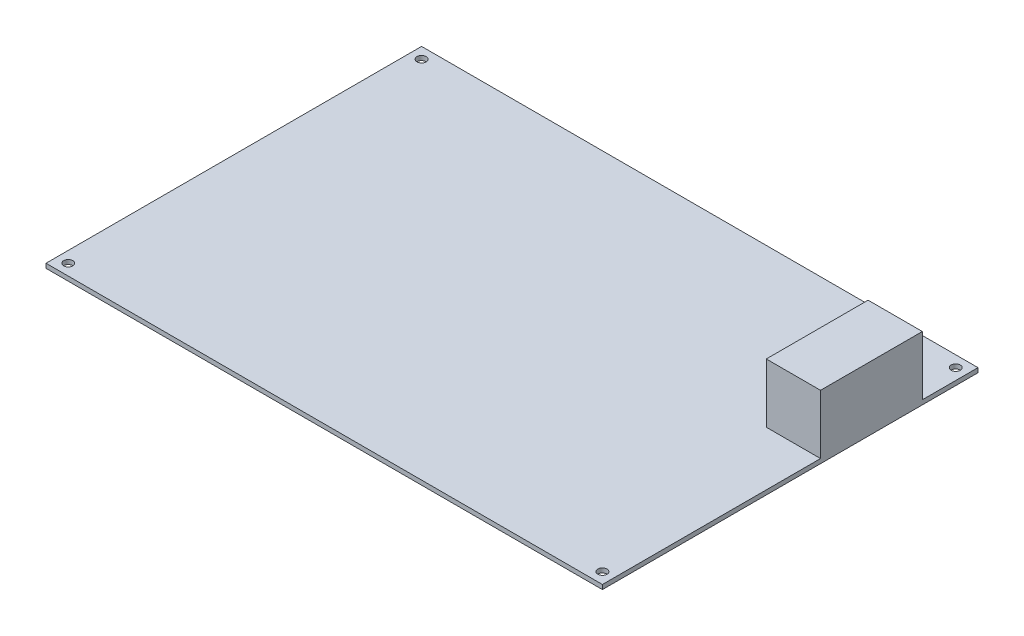
ISO-10303-21;
HEADER;
FILE_DESCRIPTION(('STEP AP214'),'2;1');
FILE_NAME('part.step','',(''),(''),'','','');
FILE_SCHEMA(('AUTOMOTIVE_DESIGN { 1 0 10303 214 1 1 1 1 }'));
ENDSEC;
DATA;
#1=APPLICATION_CONTEXT('core data for automotive mechanical design processes');
#2=APPLICATION_PROTOCOL_DEFINITION('international standard','automotive_design',2000,#1);
#3=PRODUCT_CONTEXT('',#1,'mechanical');
#4=PRODUCT('Part','Part','',(#3));
#5=PRODUCT_RELATED_PRODUCT_CATEGORY('part','',(#4));
#6=PRODUCT_DEFINITION_FORMATION('','',#4);
#7=PRODUCT_DEFINITION_CONTEXT('part definition',#1,'design');
#8=PRODUCT_DEFINITION('design','',#6,#7);
#9=PRODUCT_DEFINITION_SHAPE('','',#8);
#10=(LENGTH_UNIT() NAMED_UNIT(*) SI_UNIT(.MILLI.,.METRE.));
#11=(NAMED_UNIT(*) PLANE_ANGLE_UNIT() SI_UNIT($,.RADIAN.));
#12=(NAMED_UNIT(*) SI_UNIT($,.STERADIAN.) SOLID_ANGLE_UNIT());
#13=UNCERTAINTY_MEASURE_WITH_UNIT(LENGTH_MEASURE(1.E-05),#10,'distance_accuracy_value','');
#14=(GEOMETRIC_REPRESENTATION_CONTEXT(3) GLOBAL_UNCERTAINTY_ASSIGNED_CONTEXT((#13)) GLOBAL_UNIT_ASSIGNED_CONTEXT((#10,
#11,#12)) REPRESENTATION_CONTEXT('',''));
#15=CARTESIAN_POINT('',(0.,0.,0.));
#16=DIRECTION('',(0.,0.,1.));
#17=DIRECTION('',(1.,0.,0.));
#18=AXIS2_PLACEMENT_3D('',#15,#16,#17);
#19=CARTESIAN_POINT('',(0.,1.6,0.));
#20=DIRECTION('',(0.,-1.,0.));
#21=DIRECTION('',(0.,0.,-1.));
#22=AXIS2_PLACEMENT_3D('',#19,#20,#21);
#23=PLANE('',#22);
#24=CARTESIAN_POINT('',(196.,1.6,-4.));
#25=DIRECTION('',(0.,1.,0.));
#26=DIRECTION('',(0.,0.,-1.));
#27=AXIS2_PLACEMENT_3D('',#24,#25,#26);
#28=CIRCLE('',#27,1.65000000000002);
#29=CARTESIAN_POINT('',(196.,1.6,-5.65000000000002));
#30=VERTEX_POINT('',#29);
#31=EDGE_CURVE('E163',#30,#30,#28,.T.);
#32=ORIENTED_EDGE('',*,*,#31,.F.);
#33=EDGE_LOOP('',(#32));
#34=FACE_BOUND('',#33,.T.);
#35=CARTESIAN_POINT('',(4.00000000000003,1.6,-4.));
#36=DIRECTION('',(0.,1.,0.));
#37=DIRECTION('',(0.,0.,1.));
#38=AXIS2_PLACEMENT_3D('',#35,#36,#37);
#39=CIRCLE('',#38,1.65000000000002);
#40=CARTESIAN_POINT('',(4.00000000000003,1.6,-2.34999999999998));
#41=VERTEX_POINT('',#40);
#42=EDGE_CURVE('E171',#41,#41,#39,.T.);
#43=ORIENTED_EDGE('',*,*,#42,.F.);
#44=EDGE_LOOP('',(#43));
#45=FACE_BOUND('',#44,.T.);
#46=CARTESIAN_POINT('',(4.00000000000003,1.6,-131.));
#47=DIRECTION('',(0.,1.,0.));
#48=DIRECTION('',(0.,0.,-1.));
#49=AXIS2_PLACEMENT_3D('',#46,#47,#48);
#50=CIRCLE('',#49,1.65000000000002);
#51=CARTESIAN_POINT('',(4.00000000000003,1.6,-132.65));
#52=VERTEX_POINT('',#51);
#53=EDGE_CURVE('E179',#52,#52,#50,.T.);
#54=ORIENTED_EDGE('',*,*,#53,.F.);
#55=EDGE_LOOP('',(#54));
#56=FACE_BOUND('',#55,.T.);
#57=CARTESIAN_POINT('',(196.,1.6,-131.));
#58=DIRECTION('',(0.,1.,0.));
#59=DIRECTION('',(0.,0.,1.));
#60=AXIS2_PLACEMENT_3D('',#57,#58,#59);
#61=CIRCLE('',#60,1.65000000000002);
#62=CARTESIAN_POINT('',(196.,1.6,-129.35));
#63=VERTEX_POINT('',#62);
#64=EDGE_CURVE('E187',#63,#63,#61,.T.);
#65=ORIENTED_EDGE('',*,*,#64,.F.);
#66=EDGE_LOOP('',(#65));
#67=FACE_BOUND('',#66,.T.);
#68=DIRECTION('',(1.,0.,0.));
#69=VECTOR('',#68,1.);
#70=CARTESIAN_POINT('',(180.5,1.6,-78.4));
#71=LINE('',#70,#69);
#72=CARTESIAN_POINT('',(180.5,1.6,-78.4));
#73=VERTEX_POINT('',#72);
#74=CARTESIAN_POINT('',(200.,1.6,-78.4));
#75=VERTEX_POINT('',#74);
#76=EDGE_CURVE('E136',#73,#75,#71,.T.);
#77=ORIENTED_EDGE('',*,*,#76,.F.);
#78=DIRECTION('',(0.,0.,1.));
#79=VECTOR('',#78,1.);
#80=CARTESIAN_POINT('',(180.5,1.6,-115.));
#81=LINE('',#80,#79);
#82=CARTESIAN_POINT('',(180.5,1.6,-115.));
#83=VERTEX_POINT('',#82);
#84=EDGE_CURVE('E122',#83,#73,#81,.T.);
#85=ORIENTED_EDGE('',*,*,#84,.F.);
#86=DIRECTION('',(1.,0.,0.));
#87=VECTOR('',#86,1.);
#88=CARTESIAN_POINT('',(180.5,1.6,-115.));
#89=LINE('',#88,#87);
#90=CARTESIAN_POINT('',(200.,1.6,-115.));
#91=VERTEX_POINT('',#90);
#92=EDGE_CURVE('E158',#83,#91,#89,.T.);
#93=ORIENTED_EDGE('',*,*,#92,.T.);
#94=DIRECTION('',(0.,0.,-1.));
#95=VECTOR('',#94,1.);
#96=CARTESIAN_POINT('',(200.,1.6,0.));
#97=LINE('',#96,#95);
#98=CARTESIAN_POINT('',(200.,1.6,-135.));
#99=VERTEX_POINT('',#98);
#100=EDGE_CURVE('E200',#91,#99,#97,.T.);
#101=ORIENTED_EDGE('',*,*,#100,.T.);
#102=DIRECTION('',(-1.,0.,0.));
#103=VECTOR('',#102,1.);
#104=CARTESIAN_POINT('',(0.,1.6,-135.));
#105=LINE('',#104,#103);
#106=CARTESIAN_POINT('',(0.,1.6,-135.));
#107=VERTEX_POINT('',#106);
#108=EDGE_CURVE('E64',#99,#107,#105,.T.);
#109=ORIENTED_EDGE('',*,*,#108,.T.);
#110=DIRECTION('',(0.,0.,1.));
#111=VECTOR('',#110,1.);
#112=CARTESIAN_POINT('',(0.,1.6,0.));
#113=LINE('',#112,#111);
#114=CARTESIAN_POINT('',(0.,1.6,0.));
#115=VERTEX_POINT('',#114);
#116=EDGE_CURVE('E195',#107,#115,#113,.T.);
#117=ORIENTED_EDGE('',*,*,#116,.T.);
#118=DIRECTION('',(1.,0.,0.));
#119=VECTOR('',#118,1.);
#120=CARTESIAN_POINT('',(0.,1.6,0.));
#121=LINE('',#120,#119);
#122=CARTESIAN_POINT('',(200.,1.6,0.));
#123=VERTEX_POINT('',#122);
#124=EDGE_CURVE('E92',#115,#123,#121,.T.);
#125=ORIENTED_EDGE('',*,*,#124,.T.);
#126=EDGE_CURVE('E201',#123,#75,#97,.T.);
#127=ORIENTED_EDGE('',*,*,#126,.T.);
#128=EDGE_LOOP('',(#77,#85,#93,#101,#109,#117,#125,#127));
#129=FACE_BOUND('',#128,.T.);
#130=ADVANCED_FACE('F39',(#34,#45,#56,#67,#129),#23,.F.);
#131=CARTESIAN_POINT('',(0.,0.,0.));
#132=DIRECTION('',(0.,-1.,0.));
#133=DIRECTION('',(0.,0.,-1.));
#134=AXIS2_PLACEMENT_3D('',#131,#132,#133);
#135=PLANE('',#134);
#136=CARTESIAN_POINT('',(4.00000000000003,0.,-4.));
#137=DIRECTION('',(0.,1.,0.));
#138=DIRECTION('',(0.,0.,1.));
#139=AXIS2_PLACEMENT_3D('',#136,#137,#138);
#140=CIRCLE('',#139,1.65000000000002);
#141=CARTESIAN_POINT('',(4.00000000000003,0.,-2.34999999999998));
#142=VERTEX_POINT('',#141);
#143=EDGE_CURVE('E167',#142,#142,#140,.T.);
#144=ORIENTED_EDGE('',*,*,#143,.T.);
#145=EDGE_LOOP('',(#144));
#146=FACE_BOUND('',#145,.T.);
#147=CARTESIAN_POINT('',(196.,0.,-131.));
#148=DIRECTION('',(0.,1.,0.));
#149=DIRECTION('',(0.,0.,1.));
#150=AXIS2_PLACEMENT_3D('',#147,#148,#149);
#151=CIRCLE('',#150,1.65000000000002);
#152=CARTESIAN_POINT('',(196.,0.,-129.35));
#153=VERTEX_POINT('',#152);
#154=EDGE_CURVE('E183',#153,#153,#151,.T.);
#155=ORIENTED_EDGE('',*,*,#154,.T.);
#156=EDGE_LOOP('',(#155));
#157=FACE_BOUND('',#156,.T.);
#158=DIRECTION('',(0.,0.,1.));
#159=VECTOR('',#158,1.);
#160=CARTESIAN_POINT('',(0.,0.,0.));
#161=LINE('',#160,#159);
#162=CARTESIAN_POINT('',(0.,0.,-135.));
#163=VERTEX_POINT('',#162);
#164=CARTESIAN_POINT('',(0.,0.,0.));
#165=VERTEX_POINT('',#164);
#166=EDGE_CURVE('E191',#163,#165,#161,.T.);
#167=ORIENTED_EDGE('',*,*,#166,.F.);
#168=DIRECTION('',(-1.,0.,0.));
#169=VECTOR('',#168,1.);
#170=CARTESIAN_POINT('',(0.,0.,-135.));
#171=LINE('',#170,#169);
#172=CARTESIAN_POINT('',(200.,0.,-135.));
#173=VERTEX_POINT('',#172);
#174=EDGE_CURVE('E85',#173,#163,#171,.T.);
#175=ORIENTED_EDGE('',*,*,#174,.F.);
#176=DIRECTION('',(0.,0.,-1.));
#177=VECTOR('',#176,1.);
#178=CARTESIAN_POINT('',(200.,0.,0.));
#179=LINE('',#178,#177);
#180=CARTESIAN_POINT('',(200.,0.,0.));
#181=VERTEX_POINT('',#180);
#182=EDGE_CURVE('E214',#181,#173,#179,.T.);
#183=ORIENTED_EDGE('',*,*,#182,.F.);
#184=DIRECTION('',(1.,0.,0.));
#185=VECTOR('',#184,1.);
#186=CARTESIAN_POINT('',(0.,0.,0.));
#187=LINE('',#186,#185);
#188=EDGE_CURVE('E211',#165,#181,#187,.T.);
#189=ORIENTED_EDGE('',*,*,#188,.F.);
#190=EDGE_LOOP('',(#167,#175,#183,#189));
#191=FACE_BOUND('',#190,.T.);
#192=CARTESIAN_POINT('',(4.00000000000003,0.,-131.));
#193=DIRECTION('',(0.,1.,0.));
#194=DIRECTION('',(0.,0.,-1.));
#195=AXIS2_PLACEMENT_3D('',#192,#193,#194);
#196=CIRCLE('',#195,1.65000000000002);
#197=CARTESIAN_POINT('',(4.00000000000003,0.,-132.65));
#198=VERTEX_POINT('',#197);
#199=EDGE_CURVE('E175',#198,#198,#196,.T.);
#200=ORIENTED_EDGE('',*,*,#199,.T.);
#201=EDGE_LOOP('',(#200));
#202=FACE_BOUND('',#201,.T.);
#203=CARTESIAN_POINT('',(196.,0.,-4.));
#204=DIRECTION('',(0.,1.,0.));
#205=DIRECTION('',(0.,0.,-1.));
#206=AXIS2_PLACEMENT_3D('',#203,#204,#205);
#207=CIRCLE('',#206,1.65000000000002);
#208=CARTESIAN_POINT('',(196.,0.,-5.65000000000002));
#209=VERTEX_POINT('',#208);
#210=EDGE_CURVE('E157',#209,#209,#207,.T.);
#211=ORIENTED_EDGE('',*,*,#210,.T.);
#212=EDGE_LOOP('',(#211));
#213=FACE_BOUND('',#212,.T.);
#214=ADVANCED_FACE('F232',(#146,#157,#191,#202,#213),#135,.T.);
#215=CARTESIAN_POINT('',(0.,1.6,0.));
#216=DIRECTION('',(1.,0.,0.));
#217=DIRECTION('',(0.,0.,-1.));
#218=AXIS2_PLACEMENT_3D('',#215,#216,#217);
#219=PLANE('',#218);
#220=ORIENTED_EDGE('',*,*,#166,.T.);
#221=DIRECTION('',(0.,-1.,0.));
#222=VECTOR('',#221,1.);
#223=CARTESIAN_POINT('',(0.,1.6,0.));
#224=LINE('',#223,#222);
#225=EDGE_CURVE('E11',#115,#165,#224,.T.);
#226=ORIENTED_EDGE('',*,*,#225,.F.);
#227=ORIENTED_EDGE('',*,*,#116,.F.);
#228=DIRECTION('',(0.,-1.,0.));
#229=VECTOR('',#228,1.);
#230=CARTESIAN_POINT('',(0.,1.6,-135.));
#231=LINE('',#230,#229);
#232=EDGE_CURVE('E207',#107,#163,#231,.T.);
#233=ORIENTED_EDGE('',*,*,#232,.T.);
#234=EDGE_LOOP('',(#220,#226,#227,#233));
#235=FACE_BOUND('',#234,.T.);
#236=ADVANCED_FACE('F41',(#235),#219,.F.);
#237=CARTESIAN_POINT('',(0.,1.6,0.));
#238=DIRECTION('',(0.,0.,-1.));
#239=DIRECTION('',(-1.,0.,0.));
#240=AXIS2_PLACEMENT_3D('',#237,#238,#239);
#241=PLANE('',#240);
#242=ORIENTED_EDGE('',*,*,#188,.T.);
#243=DIRECTION('',(0.,-1.,0.));
#244=VECTOR('',#243,1.);
#245=CARTESIAN_POINT('',(200.,1.6,0.));
#246=LINE('',#245,#244);
#247=EDGE_CURVE('E48',#123,#181,#246,.T.);
#248=ORIENTED_EDGE('',*,*,#247,.F.);
#249=ORIENTED_EDGE('',*,*,#124,.F.);
#250=ORIENTED_EDGE('',*,*,#225,.T.);
#251=EDGE_LOOP('',(#242,#248,#249,#250));
#252=FACE_BOUND('',#251,.T.);
#253=ADVANCED_FACE('F268',(#252),#241,.F.);
#254=CARTESIAN_POINT('',(200.,1.6,0.));
#255=DIRECTION('',(-1.,0.,0.));
#256=DIRECTION('',(0.,0.,1.));
#257=AXIS2_PLACEMENT_3D('',#254,#255,#256);
#258=PLANE('',#257);
#259=ORIENTED_EDGE('',*,*,#182,.T.);
#260=DIRECTION('',(0.,-1.,0.));
#261=VECTOR('',#260,1.);
#262=CARTESIAN_POINT('',(200.,1.6,-135.));
#263=LINE('',#262,#261);
#264=EDGE_CURVE('E221',#99,#173,#263,.T.);
#265=ORIENTED_EDGE('',*,*,#264,.F.);
#266=ORIENTED_EDGE('',*,*,#100,.F.);
#267=DIRECTION('',(0.,1.,0.));
#268=VECTOR('',#267,1.);
#269=CARTESIAN_POINT('',(200.,1.6,-115.));
#270=LINE('',#269,#268);
#271=CARTESIAN_POINT('',(200.,22.85,-115.));
#272=VERTEX_POINT('',#271);
#273=EDGE_CURVE('E55',#91,#272,#270,.T.);
#274=ORIENTED_EDGE('',*,*,#273,.T.);
#275=DIRECTION('',(0.,0.,1.));
#276=VECTOR('',#275,1.);
#277=CARTESIAN_POINT('',(200.,22.85,-115.));
#278=LINE('',#277,#276);
#279=CARTESIAN_POINT('',(200.,22.85,-78.4));
#280=VERTEX_POINT('',#279);
#281=EDGE_CURVE('E150',#272,#280,#278,.T.);
#282=ORIENTED_EDGE('',*,*,#281,.T.);
#283=DIRECTION('',(0.,1.,0.));
#284=VECTOR('',#283,1.);
#285=CARTESIAN_POINT('',(200.,1.6,-78.4));
#286=LINE('',#285,#284);
#287=EDGE_CURVE('E131',#75,#280,#286,.T.);
#288=ORIENTED_EDGE('',*,*,#287,.F.);
#289=ORIENTED_EDGE('',*,*,#126,.F.);
#290=ORIENTED_EDGE('',*,*,#247,.T.);
#291=EDGE_LOOP('',(#259,#265,#266,#274,#282,#288,#289,#290));
#292=FACE_BOUND('',#291,.T.);
#293=ADVANCED_FACE('F228',(#292),#258,.F.);
#294=CARTESIAN_POINT('',(0.,1.6,-135.));
#295=DIRECTION('',(0.,0.,1.));
#296=DIRECTION('',(1.,0.,0.));
#297=AXIS2_PLACEMENT_3D('',#294,#295,#296);
#298=PLANE('',#297);
#299=ORIENTED_EDGE('',*,*,#174,.T.);
#300=ORIENTED_EDGE('',*,*,#232,.F.);
#301=ORIENTED_EDGE('',*,*,#108,.F.);
#302=ORIENTED_EDGE('',*,*,#264,.T.);
#303=EDGE_LOOP('',(#299,#300,#301,#302));
#304=FACE_BOUND('',#303,.T.);
#305=ADVANCED_FACE('F237',(#304),#298,.F.);
#306=CARTESIAN_POINT('',(196.,1.6,-131.));
#307=DIRECTION('',(0.,-1.,0.));
#308=DIRECTION('',(0.,0.,-1.));
#309=AXIS2_PLACEMENT_3D('',#306,#307,#308);
#310=CYLINDRICAL_SURFACE('',#309,1.65000000000002);
#311=ORIENTED_EDGE('',*,*,#64,.T.);
#312=EDGE_LOOP('',(#311));
#313=FACE_BOUND('',#312,.T.);
#314=ORIENTED_EDGE('',*,*,#154,.F.);
#315=EDGE_LOOP('',(#314));
#316=FACE_BOUND('',#315,.T.);
#317=ADVANCED_FACE('F262',(#313,#316),#310,.F.);
#318=CARTESIAN_POINT('',(4.00000000000003,1.6,-131.));
#319=DIRECTION('',(0.,-1.,0.));
#320=DIRECTION('',(0.,0.,-1.));
#321=AXIS2_PLACEMENT_3D('',#318,#319,#320);
#322=CYLINDRICAL_SURFACE('',#321,1.65000000000002);
#323=ORIENTED_EDGE('',*,*,#53,.T.);
#324=EDGE_LOOP('',(#323));
#325=FACE_BOUND('',#324,.T.);
#326=ORIENTED_EDGE('',*,*,#199,.F.);
#327=EDGE_LOOP('',(#326));
#328=FACE_BOUND('',#327,.T.);
#329=ADVANCED_FACE('F309',(#325,#328),#322,.F.);
#330=CARTESIAN_POINT('',(4.00000000000003,1.6,-4.));
#331=DIRECTION('',(0.,-1.,0.));
#332=DIRECTION('',(0.,0.,-1.));
#333=AXIS2_PLACEMENT_3D('',#330,#331,#332);
#334=CYLINDRICAL_SURFACE('',#333,1.65000000000002);
#335=ORIENTED_EDGE('',*,*,#42,.T.);
#336=EDGE_LOOP('',(#335));
#337=FACE_BOUND('',#336,.T.);
#338=ORIENTED_EDGE('',*,*,#143,.F.);
#339=EDGE_LOOP('',(#338));
#340=FACE_BOUND('',#339,.T.);
#341=ADVANCED_FACE('F317',(#337,#340),#334,.F.);
#342=CARTESIAN_POINT('',(196.,1.6,-4.));
#343=DIRECTION('',(0.,-1.,0.));
#344=DIRECTION('',(0.,0.,-1.));
#345=AXIS2_PLACEMENT_3D('',#342,#343,#344);
#346=CYLINDRICAL_SURFACE('',#345,1.65000000000002);
#347=ORIENTED_EDGE('',*,*,#31,.T.);
#348=EDGE_LOOP('',(#347));
#349=FACE_BOUND('',#348,.T.);
#350=ORIENTED_EDGE('',*,*,#210,.F.);
#351=EDGE_LOOP('',(#350));
#352=FACE_BOUND('',#351,.T.);
#353=ADVANCED_FACE('F248',(#349,#352),#346,.F.);
#354=CARTESIAN_POINT('',(180.5,22.85,-115.));
#355=DIRECTION('',(0.,1.,0.));
#356=DIRECTION('',(0.,0.,1.));
#357=AXIS2_PLACEMENT_3D('',#354,#355,#356);
#358=PLANE('',#357);
#359=ORIENTED_EDGE('',*,*,#281,.F.);
#360=DIRECTION('',(1.,0.,0.));
#361=VECTOR('',#360,1.);
#362=CARTESIAN_POINT('',(180.5,22.85,-115.));
#363=LINE('',#362,#361);
#364=CARTESIAN_POINT('',(180.5,22.85,-115.));
#365=VERTEX_POINT('',#364);
#366=EDGE_CURVE('E140',#365,#272,#363,.T.);
#367=ORIENTED_EDGE('',*,*,#366,.F.);
#368=DIRECTION('',(0.,0.,1.));
#369=VECTOR('',#368,1.);
#370=CARTESIAN_POINT('',(180.5,22.85,-115.));
#371=LINE('',#370,#369);
#372=CARTESIAN_POINT('',(180.5,22.85,-78.4));
#373=VERTEX_POINT('',#372);
#374=EDGE_CURVE('E119',#365,#373,#371,.T.);
#375=ORIENTED_EDGE('',*,*,#374,.T.);
#376=DIRECTION('',(1.,0.,0.));
#377=VECTOR('',#376,1.);
#378=CARTESIAN_POINT('',(180.5,22.85,-78.4));
#379=LINE('',#378,#377);
#380=EDGE_CURVE('E128',#373,#280,#379,.T.);
#381=ORIENTED_EDGE('',*,*,#380,.T.);
#382=EDGE_LOOP('',(#359,#367,#375,#381));
#383=FACE_BOUND('',#382,.T.);
#384=ADVANCED_FACE('F139',(#383),#358,.T.);
#385=CARTESIAN_POINT('',(180.5,1.6,-115.));
#386=DIRECTION('',(0.,0.,-1.));
#387=DIRECTION('',(-1.,0.,0.));
#388=AXIS2_PLACEMENT_3D('',#385,#386,#387);
#389=PLANE('',#388);
#390=ORIENTED_EDGE('',*,*,#273,.F.);
#391=ORIENTED_EDGE('',*,*,#92,.F.);
#392=DIRECTION('',(0.,1.,0.));
#393=VECTOR('',#392,1.);
#394=CARTESIAN_POINT('',(180.5,1.6,-115.));
#395=LINE('',#394,#393);
#396=EDGE_CURVE('E137',#83,#365,#395,.T.);
#397=ORIENTED_EDGE('',*,*,#396,.T.);
#398=ORIENTED_EDGE('',*,*,#366,.T.);
#399=EDGE_LOOP('',(#390,#391,#397,#398));
#400=FACE_BOUND('',#399,.T.);
#401=ADVANCED_FACE('F240',(#400),#389,.T.);
#402=CARTESIAN_POINT('',(180.5,1.6,-78.4));
#403=DIRECTION('',(0.,0.,-1.));
#404=DIRECTION('',(-1.,0.,0.));
#405=AXIS2_PLACEMENT_3D('',#402,#403,#404);
#406=PLANE('',#405);
#407=ORIENTED_EDGE('',*,*,#287,.T.);
#408=ORIENTED_EDGE('',*,*,#380,.F.);
#409=DIRECTION('',(0.,1.,0.));
#410=VECTOR('',#409,1.);
#411=CARTESIAN_POINT('',(180.5,1.6,-78.4));
#412=LINE('',#411,#410);
#413=EDGE_CURVE('E114',#73,#373,#412,.T.);
#414=ORIENTED_EDGE('',*,*,#413,.F.);
#415=ORIENTED_EDGE('',*,*,#76,.T.);
#416=EDGE_LOOP('',(#407,#408,#414,#415));
#417=FACE_BOUND('',#416,.T.);
#418=ADVANCED_FACE('F129',(#417),#406,.F.);
#419=CARTESIAN_POINT('',(180.5,0.,0.));
#420=DIRECTION('',(-1.,0.,0.));
#421=DIRECTION('',(0.,0.,1.));
#422=AXIS2_PLACEMENT_3D('',#419,#420,#421);
#423=PLANE('',#422);
#424=ORIENTED_EDGE('',*,*,#374,.F.);
#425=ORIENTED_EDGE('',*,*,#396,.F.);
#426=ORIENTED_EDGE('',*,*,#84,.T.);
#427=ORIENTED_EDGE('',*,*,#413,.T.);
#428=EDGE_LOOP('',(#424,#425,#426,#427));
#429=FACE_BOUND('',#428,.T.);
#430=ADVANCED_FACE('F116',(#429),#423,.T.);
#431=CLOSED_SHELL('',(#130,#214,#236,#253,#293,#305,#317,#329,#341,#353,#384,#401,#418,#430));
#432=MANIFOLD_SOLID_BREP('B2',#431);
#433=ADVANCED_BREP_SHAPE_REPRESENTATION('',(#18,#432),#14);
#434=SHAPE_DEFINITION_REPRESENTATION(#9,#433);
ENDSEC;
END-ISO-10303-21;
